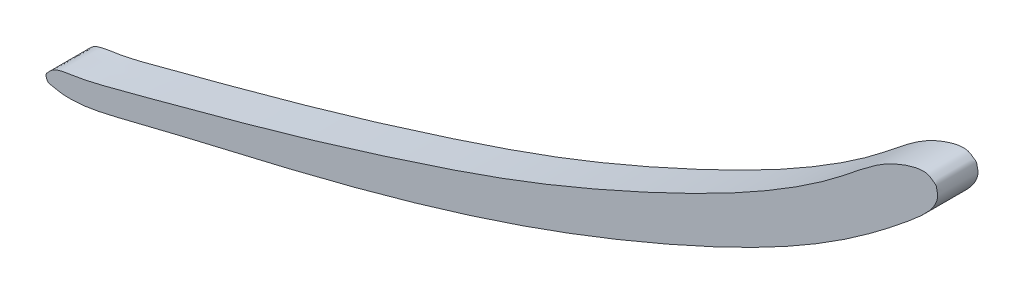
ISO-10303-21;
HEADER;
FILE_DESCRIPTION(('STEP AP214'),'2;1');
FILE_NAME('part.step','',(''),(''),'','','');
FILE_SCHEMA(('AUTOMOTIVE_DESIGN { 1 0 10303 214 1 1 1 1 }'));
ENDSEC;
DATA;
#1=APPLICATION_CONTEXT('core data for automotive mechanical design processes');
#2=APPLICATION_PROTOCOL_DEFINITION('international standard','automotive_design',2000,#1);
#3=PRODUCT_CONTEXT('',#1,'mechanical');
#4=PRODUCT('Part','Part','',(#3));
#5=PRODUCT_RELATED_PRODUCT_CATEGORY('part','',(#4));
#6=PRODUCT_DEFINITION_FORMATION('','',#4);
#7=PRODUCT_DEFINITION_CONTEXT('part definition',#1,'design');
#8=PRODUCT_DEFINITION('design','',#6,#7);
#9=PRODUCT_DEFINITION_SHAPE('','',#8);
#10=(LENGTH_UNIT() NAMED_UNIT(*) SI_UNIT(.MILLI.,.METRE.));
#11=(NAMED_UNIT(*) PLANE_ANGLE_UNIT() SI_UNIT($,.RADIAN.));
#12=(NAMED_UNIT(*) SI_UNIT($,.STERADIAN.) SOLID_ANGLE_UNIT());
#13=UNCERTAINTY_MEASURE_WITH_UNIT(LENGTH_MEASURE(1.E-05),#10,'distance_accuracy_value','');
#14=(GEOMETRIC_REPRESENTATION_CONTEXT(3) GLOBAL_UNCERTAINTY_ASSIGNED_CONTEXT((#13)) GLOBAL_UNIT_ASSIGNED_CONTEXT((#10,
#11,#12)) REPRESENTATION_CONTEXT('',''));
#15=CARTESIAN_POINT('',(0.,0.,0.));
#16=DIRECTION('',(0.,0.,1.));
#17=DIRECTION('',(1.,0.,0.));
#18=AXIS2_PLACEMENT_3D('',#15,#16,#17);
#19=CARTESIAN_POINT('',(97.6402715036178,0.,212.));
#20=CARTESIAN_POINT('',(97.5791761893551,0.113097434825663,212.));
#21=CARTESIAN_POINT('',(97.4814258269554,0.196352593071766,212.));
#22=CARTESIAN_POINT('',(97.2797911251506,0.350136693146681,212.));
#23=CARTESIAN_POINT('',(97.1743189084082,0.420472955562523,212.));
#24=CARTESIAN_POINT('',(96.9664992701994,0.565546357862091,212.));
#25=CARTESIAN_POINT('',(96.8639314628731,0.639973112238927,212.));
#26=CARTESIAN_POINT('',(96.6535180789364,0.781393552944972,212.));
#27=CARTESIAN_POINT('',(96.5458360178521,0.848425050957064,212.));
#28=CARTESIAN_POINT('',(96.3260098885516,0.971216129741667,212.));
#29=CARTESIAN_POINT('',(96.2135831688717,1.0270312472367,212.));
#30=CARTESIAN_POINT('',(95.9792028434163,1.11751138678585,212.));
#31=CARTESIAN_POINT('',(95.8566019241939,1.1526700945648,212.));
#32=CARTESIAN_POINT('',(95.4821194403895,1.23021072487811,212.));
#33=CARTESIAN_POINT('',(95.2307922515973,1.24420004913055,212.));
#34=CARTESIAN_POINT('',(94.7264770370461,1.23473047053956,212.));
#35=CARTESIAN_POINT('',(94.4727586079871,1.21024821445514,212.));
#36=CARTESIAN_POINT('',(93.9733537408801,1.14238467836488,212.));
#37=CARTESIAN_POINT('',(93.7262298830899,1.09861881118032,212.));
#38=CARTESIAN_POINT('',(92.9917557281853,0.941016030632116,212.));
#39=CARTESIAN_POINT('',(92.5108672499247,0.802535215725864,212.));
#40=CARTESIAN_POINT('',(91.5572445946872,0.494474942863385,212.));
#41=CARTESIAN_POINT('',(91.0837641417088,0.322685212673183,212.));
#42=CARTESIAN_POINT('',(90.150829286711,-0.0496923593369548,212.));
#43=CARTESIAN_POINT('',(89.6923584603408,-0.249180006693082,212.));
#44=CARTESIAN_POINT('',(88.3391236814597,-0.884525888861977,212.));
#45=CARTESIAN_POINT('',(87.4672649446348,-1.35847696871283,212.));
#46=CARTESIAN_POINT('',(84.9397030044603,-2.92670359350688,212.));
#47=CARTESIAN_POINT('',(83.3659313648548,-4.15744787210965,212.));
#48=CARTESIAN_POINT('',(81.0239462934617,-6.03381361180035,212.));
#49=CARTESIAN_POINT('',(80.24551542607,-6.66290322018702,212.));
#50=CARTESIAN_POINT('',(78.6769328903777,-7.90198740791915,212.));
#51=CARTESIAN_POINT('',(77.8880258931341,-8.51400975227565,212.));
#52=CARTESIAN_POINT('',(75.495703929223,-10.3083687731489,212.));
#53=CARTESIAN_POINT('',(73.8662802906018,-11.4483332303841,212.));
#54=CARTESIAN_POINT('',(70.5613717329283,-13.6532210709281,212.));
#55=CARTESIAN_POINT('',(68.8862994279763,-14.7188166675342,212.));
#56=CARTESIAN_POINT('',(65.5019624349238,-16.7943030881574,212.));
#57=CARTESIAN_POINT('',(63.7923749883043,-17.8036680877584,212.));
#58=CARTESIAN_POINT('',(60.3390416212229,-19.7667485579667,212.));
#59=CARTESIAN_POINT('',(58.595654061873,-20.7210478552164,212.));
#60=CARTESIAN_POINT('',(55.0821149228751,-22.5860436491215,212.));
#61=CARTESIAN_POINT('',(53.3120112360379,-23.4968181707019,212.));
#62=CARTESIAN_POINT('',(49.7523466707401,-25.286668386966,212.));
#63=CARTESIAN_POINT('',(47.9624315709493,-26.1658099124608,212.));
#64=CARTESIAN_POINT('',(42.5697532723567,-28.761623920378,212.));
#65=CARTESIAN_POINT('',(38.947924931225,-30.4362581393385,212.));
#66=CARTESIAN_POINT('',(31.6633050263558,-33.6921149190032,212.));
#67=CARTESIAN_POINT('',(28.0012309193083,-35.2732866604625,212.));
#68=CARTESIAN_POINT('',(20.6266150081669,-38.3162372115199,212.));
#69=CARTESIAN_POINT('',(16.9115314991957,-39.7751623115847,212.));
#70=CARTESIAN_POINT('',(9.43396440026264,-42.5568434419293,212.));
#71=CARTESIAN_POINT('',(5.67130593273085,-43.8808067839223,212.));
#72=CARTESIAN_POINT('',(-1.88491192240515,-46.4421753602542,212.));
#73=CARTESIAN_POINT('',(-5.67728574005016,-47.6826687476336,212.));
#74=CARTESIAN_POINT('',(-13.2759593416993,-50.1164323409612,212.));
#75=CARTESIAN_POINT('',(-17.0834892029436,-51.3074761571537,212.));
#76=CARTESIAN_POINT('',(-24.7174060622081,-53.6300951286474,212.));
#77=CARTESIAN_POINT('',(-28.5436667028384,-54.759985506367,212.));
#78=CARTESIAN_POINT('',(-40.0491359475421,-58.0556759574112,212.));
#79=CARTESIAN_POINT('',(-47.7536939404604,-60.1337292919126,212.));
#80=CARTESIAN_POINT('',(-57.387796968521,-62.7160343314417,212.));
#81=CARTESIAN_POINT('',(-59.314870922479,-63.2315556678604,212.));
#82=CARTESIAN_POINT('',(-63.1715083906307,-64.2532311940724,212.));
#83=CARTESIAN_POINT('',(-65.1006890094787,-64.7608277472113,212.));
#84=CARTESIAN_POINT('',(-67.9980551917101,-65.5084260794727,212.));
#85=CARTESIAN_POINT('',(-68.9653216952669,-65.7513936841754,212.));
#86=CARTESIAN_POINT('',(-70.9113327261605,-66.1847813188791,212.));
#87=CARTESIAN_POINT('',(-71.8902005738281,-66.3760528545392,212.));
#88=CARTESIAN_POINT('',(-73.8622259521193,-66.6882866458343,212.));
#89=CARTESIAN_POINT('',(-74.8566629544805,-66.7998239840813,212.));
#90=CARTESIAN_POINT('',(-76.3119908853258,-67.1593672778394,212.));
#91=CARTESIAN_POINT('',(-76.7964162008625,-67.3136487515221,212.));
#92=CARTESIAN_POINT('',(-77.3411951769754,-67.612730895819,212.));
#93=CARTESIAN_POINT('',(-77.4473042359936,-67.6779568079219,212.));
#94=CARTESIAN_POINT('',(-77.6525501308562,-67.8216575325256,212.));
#95=CARTESIAN_POINT('',(-77.7520868643388,-67.9006104512343,212.));
#96=CARTESIAN_POINT('',(-77.9436367416852,-68.0651966853871,212.));
#97=CARTESIAN_POINT('',(-78.0358011384498,-68.1508608752256,212.));
#98=CARTESIAN_POINT('',(-78.2132732449661,-68.3285911722357,212.));
#99=CARTESIAN_POINT('',(-78.2986048172232,-68.4206349995824,212.));
#100=CARTESIAN_POINT('',(-78.468958169911,-68.6050118991632,212.));
#101=CARTESIAN_POINT('',(-78.5539007771626,-68.6974188934163,212.));
#102=CARTESIAN_POINT('',(-78.7087710039652,-68.8962520007533,212.));
#103=CARTESIAN_POINT('',(-78.7820027454093,-69.0069505412673,212.));
#104=CARTESIAN_POINT('',(-78.8349185992612,-69.2601836581533,212.));
#105=CARTESIAN_POINT('',(-78.8143080335718,-69.3926284784747,212.));
#106=CARTESIAN_POINT('',(-78.7463007992558,-69.6390516619597,212.));
#107=CARTESIAN_POINT('',(-78.7017666690811,-69.7587180932018,212.));
#108=CARTESIAN_POINT('',(-78.597883630005,-69.993063471384,212.));
#109=CARTESIAN_POINT('',(-78.537427032215,-70.1092010101122,212.));
#110=CARTESIAN_POINT('',(-78.4031774100869,-70.2480363619875,212.));
#111=CARTESIAN_POINT('',(-78.35249608105,-70.2873776875024,212.));
#112=CARTESIAN_POINT('',(-78.2388079427947,-70.3492588735713,212.));
#113=CARTESIAN_POINT('',(-78.1784384576021,-70.3699211427805,212.));
#114=CARTESIAN_POINT('',(-77.9927677954544,-70.4186068717214,212.));
#115=CARTESIAN_POINT('',(-77.8645315225786,-70.434999971861,212.));
#116=CARTESIAN_POINT('',(-77.6109552693968,-70.4763964749393,212.));
#117=CARTESIAN_POINT('',(-77.484743628726,-70.5003312928667,212.));
#118=CARTESIAN_POINT('',(-77.1071013966302,-70.5781130340016,212.));
#119=CARTESIAN_POINT('',(-76.8564828718042,-70.6369976965743,212.));
#120=CARTESIAN_POINT('',(-76.3534295204674,-70.7435952653269,212.));
#121=CARTESIAN_POINT('',(-76.1005566017966,-70.7886135426737,212.));
#122=CARTESIAN_POINT('',(-75.3359476467371,-70.886823700144,212.));
#123=CARTESIAN_POINT('',(-74.8183739936947,-70.911742566547,212.));
#124=CARTESIAN_POINT('',(-73.2805411993199,-70.9257929748431,212.));
#125=CARTESIAN_POINT('',(-72.2632169658493,-70.8609774323383,212.));
#126=CARTESIAN_POINT('',(-70.2408851275035,-70.6156561801023,212.));
#127=CARTESIAN_POINT('',(-69.2357902397716,-70.4359703187723,212.));
#128=CARTESIAN_POINT('',(-67.2308462337457,-70.0273250519131,212.));
#129=CARTESIAN_POINT('',(-66.231942468377,-69.7983850150328,212.));
#130=CARTESIAN_POINT('',(-64.2406089813755,-69.321615301359,212.));
#131=CARTESIAN_POINT('',(-63.2469757147807,-69.0748218324662,212.));
#132=CARTESIAN_POINT('',(-60.2673876123944,-68.3290174376811,212.));
#133=CARTESIAN_POINT('',(-58.2816943789435,-67.8289151844301,212.));
#134=CARTESIAN_POINT('',(-52.3160953016026,-66.3631458088011,212.));
#135=CARTESIAN_POINT('',(-48.3293280432621,-65.4262004936401,212.));
#136=CARTESIAN_POINT('',(-40.3552381486729,-63.5550460425714,212.));
#137=CARTESIAN_POINT('',(-36.3682592993543,-62.6191226464975,212.));
#138=CARTESIAN_POINT('',(-28.4080464329399,-60.692427277343,212.));
#139=CARTESIAN_POINT('',(-24.4345793866141,-59.7025559789121,212.));
#140=CARTESIAN_POINT('',(-16.5074254321404,-57.6437939249283,212.));
#141=CARTESIAN_POINT('',(-12.5531718068016,-56.5748239812623,212.));
#142=CARTESIAN_POINT('',(-0.730902192158314,-53.2287958210245,212.));
#143=CARTESIAN_POINT('',(7.09899600283924,-50.8116713472615,212.));
#144=CARTESIAN_POINT('',(18.7141169878164,-46.8257293900068,212.));
#145=CARTESIAN_POINT('',(22.5646569961253,-45.4359435691476,212.));
#146=CARTESIAN_POINT('',(30.2234499566605,-42.5342304392706,212.));
#147=CARTESIAN_POINT('',(34.0313127274281,-41.0223198159866,212.));
#148=CARTESIAN_POINT('',(41.5994144958822,-37.8887330754146,212.));
#149=CARTESIAN_POINT('',(45.3613854553926,-36.2659216960279,212.));
#150=CARTESIAN_POINT('',(52.8272508194059,-32.8997810430862,212.));
#151=CARTESIAN_POINT('',(56.5321899730016,-31.1570302133903,212.));
#152=CARTESIAN_POINT('',(63.8605188981552,-27.4976702219522,212.));
#153=CARTESIAN_POINT('',(67.4825651166542,-25.5805603141384,212.));
#154=CARTESIAN_POINT('',(72.8022333030632,-22.5109976520817,212.));
#155=CARTESIAN_POINT('',(74.5577187921029,-21.4548240028801,212.));
#156=CARTESIAN_POINT('',(78.0237014932199,-19.269594656153,212.));
#157=CARTESIAN_POINT('',(79.7328976599107,-18.1414771100234,212.));
#158=CARTESIAN_POINT('',(84.7863794468003,-14.6465558278327,212.));
#159=CARTESIAN_POINT('',(88.052520493008,-12.1653729843958,212.));
#160=CARTESIAN_POINT('',(92.0226892975579,-8.92907880063827,212.));
#161=CARTESIAN_POINT('',(92.8112811606637,-8.27465552843717,212.));
#162=CARTESIAN_POINT('',(93.9726941924374,-7.2687418659918,212.));
#163=CARTESIAN_POINT('',(94.3553683081195,-6.92839145752925,212.));
#164=CARTESIAN_POINT('',(95.1052067295337,-6.23015750252267,212.));
#165=CARTESIAN_POINT('',(95.4733202202446,-5.8733955900667,212.));
#166=CARTESIAN_POINT('',(96.173999597746,-5.13085788860024,212.));
#167=CARTESIAN_POINT('',(96.5067708296623,-4.74456549933476,212.));
#168=CARTESIAN_POINT('',(97.1108858949798,-3.91945152616704,212.));
#169=CARTESIAN_POINT('',(97.3815047326488,-3.47574232889618,212.));
#170=CARTESIAN_POINT('',(97.6950918293272,-2.77449229285741,212.));
#171=CARTESIAN_POINT('',(97.7861539987611,-2.53375923954304,212.));
#172=CARTESIAN_POINT('',(97.9171147547223,-2.03290598185632,212.));
#173=CARTESIAN_POINT('',(97.9565347772589,-1.77939804098503,212.));
#174=CARTESIAN_POINT('',(97.9436125098254,-1.39061684363379,212.));
#175=CARTESIAN_POINT('',(97.9259029527921,-1.26107090290025,212.));
#176=CARTESIAN_POINT('',(97.8778294317182,-1.00642773217353,212.));
#177=CARTESIAN_POINT('',(97.847013089437,-0.880375668392341,212.));
#178=CARTESIAN_POINT('',(97.7881849168708,-0.627746377384552,212.));
#179=CARTESIAN_POINT('',(97.7640972775401,-0.500434319412227,212.));
#180=CARTESIAN_POINT('',(97.7306611955741,-0.308961505253714,212.));
#181=CARTESIAN_POINT('',(97.7200981937859,-0.244905212760825,212.));
#182=CARTESIAN_POINT('',(97.6907173973072,-0.119289115392413,212.));
#183=CARTESIAN_POINT('',(97.6708191607491,-0.05654871741282,212.));
#184=CARTESIAN_POINT('',(97.6402715036178,0.,212.));
#185=B_SPLINE_CURVE_WITH_KNOTS('',3,(#19,#20,#21,#22,#23,#24,#25,#26,#27,#28,#29,#30,#31,#32,
#33,#34,#35,#36,#37,#38,#39,#40,#41,#42,#43,#44,#45,#46,#47,#48,#49,#50,#51,#52,#53,#54,#55,#56,
#57,#58,#59,#60,#61,#62,#63,#64,#65,#66,#67,#68,#69,#70,#71,#72,#73,#74,#75,#76,#77,#78,#79,#80,
#81,#82,#83,#84,#85,#86,#87,#88,#89,#90,#91,#92,#93,#94,#95,#96,#97,#98,#99,#100,#101,#102,#103,
#104,#105,#106,#107,#108,#109,#110,#111,#112,#113,#114,#115,#116,#117,#118,#119,#120,#121,#122,
#123,#124,#125,#126,#127,#128,#129,#130,#131,#132,#133,#134,#135,#136,#137,#138,#139,#140,#141,
#142,#143,#144,#145,#146,#147,#148,#149,#150,#151,#152,#153,#154,#155,#156,#157,#158,#159,#160,
#161,#162,#163,#164,#165,#166,#167,#168,#169,#170,#171,#172,#173,#174,#175,#176,#177,#178,#179,
#180,#181,#182,#183,#184),.UNSPECIFIED.,.T.,.F.,(4,2,2,2,2,2,2,2,2,2,2,2,2,2,2,2,2,2,2,2,2,2,2,
2,2,2,2,2,2,2,2,2,2,2,2,2,2,2,2,2,2,2,2,2,2,2,2,2,2,2,2,2,2,2,2,2,2,2,2,2,2,2,2,2,2,2,2,2,2,2,2,
2,2,2,2,2,2,2,2,2,2,2,4),(0.,0.000976562500000018,0.00195312500000004,0.00292968750000005,
0.00390625000000007,0.00488281250000009,0.00585937500000011,0.00781250000000004,
0.00976562499999997,0.0117187499999999,0.0156249999999999,0.0195312499999998,0.0234374999999998,
0.0312499999999996,0.0468749999999994,0.0546874999999993,0.0624999999999992,0.0781249999999989,
0.0937499999999986,0.109374999999998,0.124999999999998,0.140624999999998,0.156249999999997,
0.187499999999997,0.218749999999996,0.249999999999996,0.281249999999995,0.312499999999995,
0.343749999999994,0.374999999999994,0.437499999999993,0.453124999999992,0.468749999999992,
0.476562499999992,0.484374999999992,0.492187499999992,0.496093749999992,0.497070312499992,
0.498046874999992,0.499023437499992,0.499999999999991,0.500976562499991,0.501953124999991,
0.502929687499991,0.503906249999992,0.504882812499992,0.505371093749992,0.505859374999992,
0.506835937499992,0.507812499999992,0.509765624999992,0.511718749999992,0.515624999999992,
0.523437499999992,0.531249999999992,0.539062499999992,0.546874999999992,0.562499999999993,
0.593749999999993,0.624999999999994,0.656249999999994,0.687499999999995,0.749999999999996,
0.781249999999996,0.812499999999997,0.843749999999998,0.874999999999998,0.906249999999999,
0.921874999999999,0.937499999999999,0.96875,0.9765625,0.98046875,0.984375,0.98828125,0.9921875,
0.994140625,0.99609375,0.9970703125,0.998046875,0.9990234375,0.99951171875,1.),.UNSPECIFIED.);
#186=DIRECTION('',(0.,0.,-1.));
#187=VECTOR('',#186,1.);
#188=SURFACE_OF_LINEAR_EXTRUSION('',#185,#187);
#189=CARTESIAN_POINT('',(97.6402715036178,0.,212.));
#190=CARTESIAN_POINT('',(97.6708191607491,-0.05654871741282,212.));
#191=CARTESIAN_POINT('',(97.6907173973072,-0.119289115392413,212.));
#192=CARTESIAN_POINT('',(97.7200981937859,-0.244905212760825,212.));
#193=CARTESIAN_POINT('',(97.7306611955741,-0.308961505253714,212.));
#194=CARTESIAN_POINT('',(97.7640972775401,-0.500434319412227,212.));
#195=CARTESIAN_POINT('',(97.7881849168708,-0.627746377384552,212.));
#196=CARTESIAN_POINT('',(97.847013089437,-0.880375668392341,212.));
#197=CARTESIAN_POINT('',(97.8778294317182,-1.00642773217353,212.));
#198=CARTESIAN_POINT('',(97.9259029527921,-1.26107090290025,212.));
#199=CARTESIAN_POINT('',(97.9436125098254,-1.39061684363379,212.));
#200=CARTESIAN_POINT('',(97.9565347772589,-1.77939804098503,212.));
#201=CARTESIAN_POINT('',(97.9171147547223,-2.03290598185632,212.));
#202=CARTESIAN_POINT('',(97.7861539987611,-2.53375923954304,212.));
#203=CARTESIAN_POINT('',(97.6950918293272,-2.77449229285741,212.));
#204=CARTESIAN_POINT('',(97.3815047326488,-3.47574232889618,212.));
#205=CARTESIAN_POINT('',(97.1108858949798,-3.91945152616704,212.));
#206=CARTESIAN_POINT('',(96.5067708296623,-4.74456549933476,212.));
#207=CARTESIAN_POINT('',(96.173999597746,-5.13085788860024,212.));
#208=CARTESIAN_POINT('',(95.4733202202446,-5.8733955900667,212.));
#209=CARTESIAN_POINT('',(95.1052067295337,-6.23015750252267,212.));
#210=CARTESIAN_POINT('',(94.3553683081195,-6.92839145752925,212.));
#211=CARTESIAN_POINT('',(93.9726941924374,-7.2687418659918,212.));
#212=CARTESIAN_POINT('',(92.8112811606637,-8.27465552843717,212.));
#213=CARTESIAN_POINT('',(92.0226892975579,-8.92907880063827,212.));
#214=CARTESIAN_POINT('',(88.052520493008,-12.1653729843958,212.));
#215=CARTESIAN_POINT('',(84.7863794468003,-14.6465558278327,212.));
#216=CARTESIAN_POINT('',(79.7328976599107,-18.1414771100234,212.));
#217=CARTESIAN_POINT('',(78.0237014932199,-19.269594656153,212.));
#218=CARTESIAN_POINT('',(74.5577187921029,-21.4548240028801,212.));
#219=CARTESIAN_POINT('',(72.8022333030632,-22.5109976520817,212.));
#220=CARTESIAN_POINT('',(67.4825651166542,-25.5805603141384,212.));
#221=CARTESIAN_POINT('',(63.8605188981552,-27.4976702219522,212.));
#222=CARTESIAN_POINT('',(56.5321899730016,-31.1570302133903,212.));
#223=CARTESIAN_POINT('',(52.8272508194059,-32.8997810430862,212.));
#224=CARTESIAN_POINT('',(45.3613854553926,-36.2659216960279,212.));
#225=CARTESIAN_POINT('',(41.5994144958822,-37.8887330754146,212.));
#226=CARTESIAN_POINT('',(34.0313127274281,-41.0223198159866,212.));
#227=CARTESIAN_POINT('',(30.2234499566605,-42.5342304392706,212.));
#228=CARTESIAN_POINT('',(22.5646569961253,-45.4359435691476,212.));
#229=CARTESIAN_POINT('',(18.7141169878164,-46.8257293900068,212.));
#230=CARTESIAN_POINT('',(7.09899600283924,-50.8116713472615,212.));
#231=CARTESIAN_POINT('',(-0.730902192158314,-53.2287958210245,212.));
#232=CARTESIAN_POINT('',(-12.5531718068016,-56.5748239812623,212.));
#233=CARTESIAN_POINT('',(-16.5074254321404,-57.6437939249283,212.));
#234=CARTESIAN_POINT('',(-24.4345793866141,-59.7025559789121,212.));
#235=CARTESIAN_POINT('',(-28.4080464329399,-60.692427277343,212.));
#236=CARTESIAN_POINT('',(-36.3682592993543,-62.6191226464975,212.));
#237=CARTESIAN_POINT('',(-40.3552381486729,-63.5550460425714,212.));
#238=CARTESIAN_POINT('',(-48.3293280432621,-65.4262004936401,212.));
#239=CARTESIAN_POINT('',(-52.3160953016026,-66.3631458088011,212.));
#240=CARTESIAN_POINT('',(-58.2816943789435,-67.8289151844301,212.));
#241=CARTESIAN_POINT('',(-60.2673876123944,-68.3290174376811,212.));
#242=CARTESIAN_POINT('',(-63.2469757147807,-69.0748218324662,212.));
#243=CARTESIAN_POINT('',(-64.2406089813755,-69.321615301359,212.));
#244=CARTESIAN_POINT('',(-66.231942468377,-69.7983850150328,212.));
#245=CARTESIAN_POINT('',(-67.2308462337457,-70.0273250519131,212.));
#246=CARTESIAN_POINT('',(-69.2357902397716,-70.4359703187723,212.));
#247=CARTESIAN_POINT('',(-70.2408851275035,-70.6156561801023,212.));
#248=CARTESIAN_POINT('',(-72.2632169658493,-70.8609774323383,212.));
#249=CARTESIAN_POINT('',(-73.2805411993199,-70.9257929748431,212.));
#250=CARTESIAN_POINT('',(-74.8183739936947,-70.911742566547,212.));
#251=CARTESIAN_POINT('',(-75.3359476467371,-70.886823700144,212.));
#252=CARTESIAN_POINT('',(-76.1005566017966,-70.7886135426737,212.));
#253=CARTESIAN_POINT('',(-76.3534295204674,-70.7435952653269,212.));
#254=CARTESIAN_POINT('',(-76.8564828718042,-70.6369976965743,212.));
#255=CARTESIAN_POINT('',(-77.1071013966302,-70.5781130340016,212.));
#256=CARTESIAN_POINT('',(-77.484743628726,-70.5003312928667,212.));
#257=CARTESIAN_POINT('',(-77.6109552693968,-70.4763964749393,212.));
#258=CARTESIAN_POINT('',(-77.8645315225786,-70.434999971861,212.));
#259=CARTESIAN_POINT('',(-77.9927677954544,-70.4186068717214,212.));
#260=CARTESIAN_POINT('',(-78.1784384576021,-70.3699211427805,212.));
#261=CARTESIAN_POINT('',(-78.2388079427947,-70.3492588735713,212.));
#262=CARTESIAN_POINT('',(-78.35249608105,-70.2873776875024,212.));
#263=CARTESIAN_POINT('',(-78.4031774100869,-70.2480363619875,212.));
#264=CARTESIAN_POINT('',(-78.537427032215,-70.1092010101122,212.));
#265=CARTESIAN_POINT('',(-78.597883630005,-69.993063471384,212.));
#266=CARTESIAN_POINT('',(-78.7017666690811,-69.7587180932018,212.));
#267=CARTESIAN_POINT('',(-78.7463007992558,-69.6390516619597,212.));
#268=CARTESIAN_POINT('',(-78.8143080335718,-69.3926284784747,212.));
#269=CARTESIAN_POINT('',(-78.8349185992612,-69.2601836581533,212.));
#270=CARTESIAN_POINT('',(-78.7820027454093,-69.0069505412673,212.));
#271=CARTESIAN_POINT('',(-78.7087710039652,-68.8962520007533,212.));
#272=CARTESIAN_POINT('',(-78.5539007771626,-68.6974188934163,212.));
#273=CARTESIAN_POINT('',(-78.468958169911,-68.6050118991632,212.));
#274=CARTESIAN_POINT('',(-78.2986048172232,-68.4206349995824,212.));
#275=CARTESIAN_POINT('',(-78.2132732449661,-68.3285911722357,212.));
#276=CARTESIAN_POINT('',(-78.0358011384498,-68.1508608752256,212.));
#277=CARTESIAN_POINT('',(-77.9436367416852,-68.0651966853871,212.));
#278=CARTESIAN_POINT('',(-77.7520868643388,-67.9006104512343,212.));
#279=CARTESIAN_POINT('',(-77.6525501308562,-67.8216575325256,212.));
#280=CARTESIAN_POINT('',(-77.4473042359936,-67.6779568079219,212.));
#281=CARTESIAN_POINT('',(-77.3411951769754,-67.612730895819,212.));
#282=CARTESIAN_POINT('',(-76.7964162008625,-67.3136487515221,212.));
#283=CARTESIAN_POINT('',(-76.3119908853258,-67.1593672778394,212.));
#284=CARTESIAN_POINT('',(-74.8566629544805,-66.7998239840813,212.));
#285=CARTESIAN_POINT('',(-73.8622259521193,-66.6882866458343,212.));
#286=CARTESIAN_POINT('',(-71.8902005738281,-66.3760528545392,212.));
#287=CARTESIAN_POINT('',(-70.9113327261605,-66.1847813188791,212.));
#288=CARTESIAN_POINT('',(-68.9653216952669,-65.7513936841754,212.));
#289=CARTESIAN_POINT('',(-67.9980551917101,-65.5084260794727,212.));
#290=CARTESIAN_POINT('',(-65.1006890094787,-64.7608277472113,212.));
#291=CARTESIAN_POINT('',(-63.1715083906307,-64.2532311940724,212.));
#292=CARTESIAN_POINT('',(-59.314870922479,-63.2315556678604,212.));
#293=CARTESIAN_POINT('',(-57.387796968521,-62.7160343314417,212.));
#294=CARTESIAN_POINT('',(-47.7536939404604,-60.1337292919126,212.));
#295=CARTESIAN_POINT('',(-40.0491359475421,-58.0556759574112,212.));
#296=CARTESIAN_POINT('',(-28.5436667028384,-54.759985506367,212.));
#297=CARTESIAN_POINT('',(-24.7174060622081,-53.6300951286474,212.));
#298=CARTESIAN_POINT('',(-17.0834892029436,-51.3074761571537,212.));
#299=CARTESIAN_POINT('',(-13.2759593416993,-50.1164323409612,212.));
#300=CARTESIAN_POINT('',(-5.67728574005016,-47.6826687476336,212.));
#301=CARTESIAN_POINT('',(-1.88491192240515,-46.4421753602542,212.));
#302=CARTESIAN_POINT('',(5.67130593273085,-43.8808067839223,212.));
#303=CARTESIAN_POINT('',(9.43396440026264,-42.5568434419293,212.));
#304=CARTESIAN_POINT('',(16.9115314991957,-39.7751623115847,212.));
#305=CARTESIAN_POINT('',(20.6266150081669,-38.3162372115199,212.));
#306=CARTESIAN_POINT('',(28.0012309193083,-35.2732866604625,212.));
#307=CARTESIAN_POINT('',(31.6633050263558,-33.6921149190032,212.));
#308=CARTESIAN_POINT('',(38.947924931225,-30.4362581393385,212.));
#309=CARTESIAN_POINT('',(42.5697532723567,-28.761623920378,212.));
#310=CARTESIAN_POINT('',(47.9624315709493,-26.1658099124608,212.));
#311=CARTESIAN_POINT('',(49.7523466707401,-25.286668386966,212.));
#312=CARTESIAN_POINT('',(53.3120112360379,-23.4968181707019,212.));
#313=CARTESIAN_POINT('',(55.0821149228751,-22.5860436491215,212.));
#314=CARTESIAN_POINT('',(58.595654061873,-20.7210478552164,212.));
#315=CARTESIAN_POINT('',(60.3390416212229,-19.7667485579667,212.));
#316=CARTESIAN_POINT('',(63.7923749883043,-17.8036680877584,212.));
#317=CARTESIAN_POINT('',(65.5019624349238,-16.7943030881574,212.));
#318=CARTESIAN_POINT('',(68.8862994279763,-14.7188166675342,212.));
#319=CARTESIAN_POINT('',(70.5613717329283,-13.6532210709281,212.));
#320=CARTESIAN_POINT('',(73.8662802906018,-11.4483332303841,212.));
#321=CARTESIAN_POINT('',(75.495703929223,-10.3083687731489,212.));
#322=CARTESIAN_POINT('',(77.8880258931341,-8.51400975227565,212.));
#323=CARTESIAN_POINT('',(78.6769328903777,-7.90198740791915,212.));
#324=CARTESIAN_POINT('',(80.24551542607,-6.66290322018702,212.));
#325=CARTESIAN_POINT('',(81.0239462934617,-6.03381361180035,212.));
#326=CARTESIAN_POINT('',(83.3659313648548,-4.15744787210965,212.));
#327=CARTESIAN_POINT('',(84.9397030044603,-2.92670359350688,212.));
#328=CARTESIAN_POINT('',(87.4672649446348,-1.35847696871283,212.));
#329=CARTESIAN_POINT('',(88.3391236814597,-0.884525888861977,212.));
#330=CARTESIAN_POINT('',(89.6923584603408,-0.249180006693082,212.));
#331=CARTESIAN_POINT('',(90.150829286711,-0.0496923593369548,212.));
#332=CARTESIAN_POINT('',(91.0837641417088,0.322685212673183,212.));
#333=CARTESIAN_POINT('',(91.5572445946872,0.494474942863385,212.));
#334=CARTESIAN_POINT('',(92.5108672499247,0.802535215725864,212.));
#335=CARTESIAN_POINT('',(92.9917557281853,0.941016030632116,212.));
#336=CARTESIAN_POINT('',(93.7262298830899,1.09861881118032,212.));
#337=CARTESIAN_POINT('',(93.9733537408801,1.14238467836488,212.));
#338=CARTESIAN_POINT('',(94.4727586079871,1.21024821445514,212.));
#339=CARTESIAN_POINT('',(94.7264770370461,1.23473047053956,212.));
#340=CARTESIAN_POINT('',(95.2307922515973,1.24420004913055,212.));
#341=CARTESIAN_POINT('',(95.4821194403895,1.23021072487811,212.));
#342=CARTESIAN_POINT('',(95.8566019241939,1.1526700945648,212.));
#343=CARTESIAN_POINT('',(95.9792028434163,1.11751138678585,212.));
#344=CARTESIAN_POINT('',(96.2135831688717,1.0270312472367,212.));
#345=CARTESIAN_POINT('',(96.3260098885516,0.971216129741667,212.));
#346=CARTESIAN_POINT('',(96.5458360178521,0.848425050957064,212.));
#347=CARTESIAN_POINT('',(96.6535180789364,0.781393552944972,212.));
#348=CARTESIAN_POINT('',(96.8639314628731,0.639973112238927,212.));
#349=CARTESIAN_POINT('',(96.9664992701994,0.565546357862091,212.));
#350=CARTESIAN_POINT('',(97.1743189084082,0.420472955562523,212.));
#351=CARTESIAN_POINT('',(97.2797911251506,0.350136693146681,212.));
#352=CARTESIAN_POINT('',(97.4814258269554,0.196352593071766,212.));
#353=CARTESIAN_POINT('',(97.5791761893551,0.113097434825663,212.));
#354=CARTESIAN_POINT('',(97.6402715036178,0.,212.));
#355=B_SPLINE_CURVE_WITH_KNOTS('',3,(#189,#190,#191,#192,#193,#194,#195,#196,#197,#198,#199,
#200,#201,#202,#203,#204,#205,#206,#207,#208,#209,#210,#211,#212,#213,#214,#215,#216,#217,#218,
#219,#220,#221,#222,#223,#224,#225,#226,#227,#228,#229,#230,#231,#232,#233,#234,#235,#236,#237,
#238,#239,#240,#241,#242,#243,#244,#245,#246,#247,#248,#249,#250,#251,#252,#253,#254,#255,#256,
#257,#258,#259,#260,#261,#262,#263,#264,#265,#266,#267,#268,#269,#270,#271,#272,#273,#274,#275,
#276,#277,#278,#279,#280,#281,#282,#283,#284,#285,#286,#287,#288,#289,#290,#291,#292,#293,#294,
#295,#296,#297,#298,#299,#300,#301,#302,#303,#304,#305,#306,#307,#308,#309,#310,#311,#312,#313,
#314,#315,#316,#317,#318,#319,#320,#321,#322,#323,#324,#325,#326,#327,#328,#329,#330,#331,#332,
#333,#334,#335,#336,#337,#338,#339,#340,#341,#342,#343,#344,#345,#346,#347,#348,#349,#350,#351,
#352,#353,#354),.UNSPECIFIED.,.T.,.F.,(4,2,2,2,2,2,2,2,2,2,2,2,2,2,2,2,2,2,2,2,2,2,2,2,2,2,2,2,
2,2,2,2,2,2,2,2,2,2,2,2,2,2,2,2,2,2,2,2,2,2,2,2,2,2,2,2,2,2,2,2,2,2,2,2,2,2,2,2,2,2,2,2,2,2,2,2,
2,2,2,2,2,2,4),(0.,0.000488281249999889,0.000976562499999889,0.00195312499999989,
0.00292968749999989,0.00390625,0.005859375,0.0078125,0.0117187500000001,0.0156250000000002,
0.0195312500000002,0.0234375000000003,0.0312500000000004,0.0625000000000009,0.0781250000000011,
0.0937500000000012,0.125000000000002,0.156250000000002,0.187500000000003,0.218750000000004,
0.250000000000004,0.312500000000005,0.343750000000006,0.375000000000006,0.406250000000007,
0.437500000000007,0.453125000000008,0.460937500000008,0.468750000000008,0.476562500000008,
0.484375000000008,0.488281250000008,0.490234375000008,0.492187500000008,0.493164062500008,
0.494140625000008,0.494628906250008,0.495117187500008,0.496093750000008,0.497070312500009,
0.498046875000009,0.499023437500009,0.500000000000009,0.500976562500008,0.501953125000008,
0.502929687500008,0.503906250000008,0.507812500000008,0.515625000000008,0.523437500000008,
0.531250000000008,0.546875000000008,0.562500000000007,0.625000000000006,0.656250000000006,
0.687500000000005,0.718750000000005,0.750000000000004,0.781250000000004,0.812500000000003,
0.843750000000003,0.859375000000002,0.875000000000002,0.890625000000002,0.906250000000001,
0.921875000000001,0.937500000000001,0.945312500000001,0.953125000000001,0.96875,0.9765625,
0.98046875,0.984375,0.98828125,0.990234375,0.9921875,0.994140625,0.9951171875,0.99609375,
0.9970703125,0.998046875,0.9990234375,1.),.UNSPECIFIED.);
#356=CARTESIAN_POINT('',(97.6402715036178,0.,212.));
#357=VERTEX_POINT('',#356);
#358=EDGE_CURVE('E10',#357,#357,#355,.F.);
#359=ORIENTED_EDGE('',*,*,#358,.F.);
#360=EDGE_LOOP('',(#359));
#361=FACE_BOUND('',#360,.T.);
#362=CARTESIAN_POINT('',(97.6402715036178,0.,204.));
#363=CARTESIAN_POINT('',(97.5791761893551,0.113097434825663,204.));
#364=CARTESIAN_POINT('',(97.4814258269554,0.196352593071766,204.));
#365=CARTESIAN_POINT('',(97.2797911251506,0.350136693146681,204.));
#366=CARTESIAN_POINT('',(97.1743189084082,0.420472955562523,204.));
#367=CARTESIAN_POINT('',(96.9664992701994,0.565546357862091,204.));
#368=CARTESIAN_POINT('',(96.8639314628731,0.639973112238927,204.));
#369=CARTESIAN_POINT('',(96.6535180789364,0.781393552944972,204.));
#370=CARTESIAN_POINT('',(96.5458360178521,0.848425050957064,204.));
#371=CARTESIAN_POINT('',(96.3260098885516,0.971216129741667,204.));
#372=CARTESIAN_POINT('',(96.2135831688717,1.0270312472367,204.));
#373=CARTESIAN_POINT('',(95.9792028434163,1.11751138678585,204.));
#374=CARTESIAN_POINT('',(95.8566019241939,1.1526700945648,204.));
#375=CARTESIAN_POINT('',(95.4821194403895,1.23021072487811,204.));
#376=CARTESIAN_POINT('',(95.2307922515973,1.24420004913055,204.));
#377=CARTESIAN_POINT('',(94.7264770370461,1.23473047053956,204.));
#378=CARTESIAN_POINT('',(94.4727586079871,1.21024821445514,204.));
#379=CARTESIAN_POINT('',(93.9733537408801,1.14238467836488,204.));
#380=CARTESIAN_POINT('',(93.7262298830899,1.09861881118032,204.));
#381=CARTESIAN_POINT('',(92.9917557281853,0.941016030632116,204.));
#382=CARTESIAN_POINT('',(92.5108672499247,0.802535215725864,204.));
#383=CARTESIAN_POINT('',(91.5572445946872,0.494474942863385,204.));
#384=CARTESIAN_POINT('',(91.0837641417088,0.322685212673183,204.));
#385=CARTESIAN_POINT('',(90.150829286711,-0.0496923593369548,204.));
#386=CARTESIAN_POINT('',(89.6923584603408,-0.249180006693082,204.));
#387=CARTESIAN_POINT('',(88.3391236814597,-0.884525888861977,204.));
#388=CARTESIAN_POINT('',(87.4672649446348,-1.35847696871283,204.));
#389=CARTESIAN_POINT('',(84.9397030044603,-2.92670359350688,204.));
#390=CARTESIAN_POINT('',(83.3659313648548,-4.15744787210965,204.));
#391=CARTESIAN_POINT('',(81.0239462934617,-6.03381361180035,204.));
#392=CARTESIAN_POINT('',(80.24551542607,-6.66290322018702,204.));
#393=CARTESIAN_POINT('',(78.6769328903777,-7.90198740791915,204.));
#394=CARTESIAN_POINT('',(77.8880258931341,-8.51400975227565,204.));
#395=CARTESIAN_POINT('',(75.495703929223,-10.3083687731489,204.));
#396=CARTESIAN_POINT('',(73.8662802906018,-11.4483332303841,204.));
#397=CARTESIAN_POINT('',(70.5613717329283,-13.6532210709281,204.));
#398=CARTESIAN_POINT('',(68.8862994279763,-14.7188166675342,204.));
#399=CARTESIAN_POINT('',(65.5019624349238,-16.7943030881574,204.));
#400=CARTESIAN_POINT('',(63.7923749883043,-17.8036680877584,204.));
#401=CARTESIAN_POINT('',(60.3390416212229,-19.7667485579667,204.));
#402=CARTESIAN_POINT('',(58.595654061873,-20.7210478552164,204.));
#403=CARTESIAN_POINT('',(55.0821149228751,-22.5860436491215,204.));
#404=CARTESIAN_POINT('',(53.3120112360379,-23.4968181707019,204.));
#405=CARTESIAN_POINT('',(49.7523466707401,-25.286668386966,204.));
#406=CARTESIAN_POINT('',(47.9624315709493,-26.1658099124608,204.));
#407=CARTESIAN_POINT('',(42.5697532723567,-28.761623920378,204.));
#408=CARTESIAN_POINT('',(38.947924931225,-30.4362581393385,204.));
#409=CARTESIAN_POINT('',(31.6633050263558,-33.6921149190032,204.));
#410=CARTESIAN_POINT('',(28.0012309193083,-35.2732866604625,204.));
#411=CARTESIAN_POINT('',(20.6266150081669,-38.3162372115199,204.));
#412=CARTESIAN_POINT('',(16.9115314991957,-39.7751623115847,204.));
#413=CARTESIAN_POINT('',(9.43396440026264,-42.5568434419293,204.));
#414=CARTESIAN_POINT('',(5.67130593273085,-43.8808067839223,204.));
#415=CARTESIAN_POINT('',(-1.88491192240515,-46.4421753602542,204.));
#416=CARTESIAN_POINT('',(-5.67728574005016,-47.6826687476336,204.));
#417=CARTESIAN_POINT('',(-13.2759593416993,-50.1164323409612,204.));
#418=CARTESIAN_POINT('',(-17.0834892029436,-51.3074761571537,204.));
#419=CARTESIAN_POINT('',(-24.7174060622081,-53.6300951286474,204.));
#420=CARTESIAN_POINT('',(-28.5436667028384,-54.759985506367,204.));
#421=CARTESIAN_POINT('',(-40.0491359475421,-58.0556759574112,204.));
#422=CARTESIAN_POINT('',(-47.7536939404604,-60.1337292919126,204.));
#423=CARTESIAN_POINT('',(-57.387796968521,-62.7160343314417,204.));
#424=CARTESIAN_POINT('',(-59.314870922479,-63.2315556678604,204.));
#425=CARTESIAN_POINT('',(-63.1715083906307,-64.2532311940724,204.));
#426=CARTESIAN_POINT('',(-65.1006890094787,-64.7608277472113,204.));
#427=CARTESIAN_POINT('',(-67.9980551917101,-65.5084260794727,204.));
#428=CARTESIAN_POINT('',(-68.9653216952669,-65.7513936841754,204.));
#429=CARTESIAN_POINT('',(-70.9113327261605,-66.1847813188791,204.));
#430=CARTESIAN_POINT('',(-71.8902005738281,-66.3760528545392,204.));
#431=CARTESIAN_POINT('',(-73.8622259521193,-66.6882866458343,204.));
#432=CARTESIAN_POINT('',(-74.8566629544805,-66.7998239840813,204.));
#433=CARTESIAN_POINT('',(-76.3119908853258,-67.1593672778394,204.));
#434=CARTESIAN_POINT('',(-76.7964162008625,-67.3136487515221,204.));
#435=CARTESIAN_POINT('',(-77.3411951769754,-67.612730895819,204.));
#436=CARTESIAN_POINT('',(-77.4473042359936,-67.6779568079219,204.));
#437=CARTESIAN_POINT('',(-77.6525501308562,-67.8216575325256,204.));
#438=CARTESIAN_POINT('',(-77.7520868643388,-67.9006104512343,204.));
#439=CARTESIAN_POINT('',(-77.9436367416852,-68.0651966853871,204.));
#440=CARTESIAN_POINT('',(-78.0358011384498,-68.1508608752256,204.));
#441=CARTESIAN_POINT('',(-78.2132732449661,-68.3285911722357,204.));
#442=CARTESIAN_POINT('',(-78.2986048172232,-68.4206349995824,204.));
#443=CARTESIAN_POINT('',(-78.468958169911,-68.6050118991632,204.));
#444=CARTESIAN_POINT('',(-78.5539007771626,-68.6974188934163,204.));
#445=CARTESIAN_POINT('',(-78.7087710039652,-68.8962520007533,204.));
#446=CARTESIAN_POINT('',(-78.7820027454093,-69.0069505412673,204.));
#447=CARTESIAN_POINT('',(-78.8349185992612,-69.2601836581533,204.));
#448=CARTESIAN_POINT('',(-78.8143080335718,-69.3926284784747,204.));
#449=CARTESIAN_POINT('',(-78.7463007992558,-69.6390516619597,204.));
#450=CARTESIAN_POINT('',(-78.7017666690811,-69.7587180932018,204.));
#451=CARTESIAN_POINT('',(-78.597883630005,-69.993063471384,204.));
#452=CARTESIAN_POINT('',(-78.537427032215,-70.1092010101122,204.));
#453=CARTESIAN_POINT('',(-78.4031774100869,-70.2480363619875,204.));
#454=CARTESIAN_POINT('',(-78.35249608105,-70.2873776875024,204.));
#455=CARTESIAN_POINT('',(-78.2388079427947,-70.3492588735713,204.));
#456=CARTESIAN_POINT('',(-78.1784384576021,-70.3699211427805,204.));
#457=CARTESIAN_POINT('',(-77.9927677954544,-70.4186068717214,204.));
#458=CARTESIAN_POINT('',(-77.8645315225786,-70.434999971861,204.));
#459=CARTESIAN_POINT('',(-77.6109552693968,-70.4763964749393,204.));
#460=CARTESIAN_POINT('',(-77.484743628726,-70.5003312928667,204.));
#461=CARTESIAN_POINT('',(-77.1071013966302,-70.5781130340016,204.));
#462=CARTESIAN_POINT('',(-76.8564828718042,-70.6369976965743,204.));
#463=CARTESIAN_POINT('',(-76.3534295204674,-70.7435952653269,204.));
#464=CARTESIAN_POINT('',(-76.1005566017966,-70.7886135426737,204.));
#465=CARTESIAN_POINT('',(-75.3359476467371,-70.886823700144,204.));
#466=CARTESIAN_POINT('',(-74.8183739936947,-70.911742566547,204.));
#467=CARTESIAN_POINT('',(-73.2805411993199,-70.9257929748431,204.));
#468=CARTESIAN_POINT('',(-72.2632169658493,-70.8609774323383,204.));
#469=CARTESIAN_POINT('',(-70.2408851275035,-70.6156561801023,204.));
#470=CARTESIAN_POINT('',(-69.2357902397716,-70.4359703187723,204.));
#471=CARTESIAN_POINT('',(-67.2308462337457,-70.0273250519131,204.));
#472=CARTESIAN_POINT('',(-66.231942468377,-69.7983850150328,204.));
#473=CARTESIAN_POINT('',(-64.2406089813755,-69.321615301359,204.));
#474=CARTESIAN_POINT('',(-63.2469757147807,-69.0748218324662,204.));
#475=CARTESIAN_POINT('',(-60.2673876123944,-68.3290174376811,204.));
#476=CARTESIAN_POINT('',(-58.2816943789435,-67.8289151844301,204.));
#477=CARTESIAN_POINT('',(-52.3160953016026,-66.3631458088011,204.));
#478=CARTESIAN_POINT('',(-48.3293280432621,-65.4262004936401,204.));
#479=CARTESIAN_POINT('',(-40.3552381486729,-63.5550460425714,204.));
#480=CARTESIAN_POINT('',(-36.3682592993543,-62.6191226464975,204.));
#481=CARTESIAN_POINT('',(-28.4080464329399,-60.692427277343,204.));
#482=CARTESIAN_POINT('',(-24.4345793866141,-59.7025559789121,204.));
#483=CARTESIAN_POINT('',(-16.5074254321404,-57.6437939249283,204.));
#484=CARTESIAN_POINT('',(-12.5531718068016,-56.5748239812623,204.));
#485=CARTESIAN_POINT('',(-0.730902192158314,-53.2287958210245,204.));
#486=CARTESIAN_POINT('',(7.09899600283924,-50.8116713472615,204.));
#487=CARTESIAN_POINT('',(18.7141169878164,-46.8257293900068,204.));
#488=CARTESIAN_POINT('',(22.5646569961253,-45.4359435691476,204.));
#489=CARTESIAN_POINT('',(30.2234499566605,-42.5342304392706,204.));
#490=CARTESIAN_POINT('',(34.0313127274281,-41.0223198159866,204.));
#491=CARTESIAN_POINT('',(41.5994144958822,-37.8887330754146,204.));
#492=CARTESIAN_POINT('',(45.3613854553926,-36.2659216960279,204.));
#493=CARTESIAN_POINT('',(52.8272508194059,-32.8997810430862,204.));
#494=CARTESIAN_POINT('',(56.5321899730016,-31.1570302133903,204.));
#495=CARTESIAN_POINT('',(63.8605188981552,-27.4976702219522,204.));
#496=CARTESIAN_POINT('',(67.4825651166542,-25.5805603141384,204.));
#497=CARTESIAN_POINT('',(72.8022333030632,-22.5109976520817,204.));
#498=CARTESIAN_POINT('',(74.5577187921029,-21.4548240028801,204.));
#499=CARTESIAN_POINT('',(78.0237014932199,-19.269594656153,204.));
#500=CARTESIAN_POINT('',(79.7328976599107,-18.1414771100234,204.));
#501=CARTESIAN_POINT('',(84.7863794468003,-14.6465558278327,204.));
#502=CARTESIAN_POINT('',(88.052520493008,-12.1653729843958,204.));
#503=CARTESIAN_POINT('',(92.0226892975579,-8.92907880063827,204.));
#504=CARTESIAN_POINT('',(92.8112811606637,-8.27465552843717,204.));
#505=CARTESIAN_POINT('',(93.9726941924374,-7.2687418659918,204.));
#506=CARTESIAN_POINT('',(94.3553683081195,-6.92839145752925,204.));
#507=CARTESIAN_POINT('',(95.1052067295337,-6.23015750252267,204.));
#508=CARTESIAN_POINT('',(95.4733202202446,-5.8733955900667,204.));
#509=CARTESIAN_POINT('',(96.173999597746,-5.13085788860024,204.));
#510=CARTESIAN_POINT('',(96.5067708296623,-4.74456549933476,204.));
#511=CARTESIAN_POINT('',(97.1108858949798,-3.91945152616704,204.));
#512=CARTESIAN_POINT('',(97.3815047326488,-3.47574232889618,204.));
#513=CARTESIAN_POINT('',(97.6950918293272,-2.77449229285741,204.));
#514=CARTESIAN_POINT('',(97.7861539987611,-2.53375923954304,204.));
#515=CARTESIAN_POINT('',(97.9171147547223,-2.03290598185632,204.));
#516=CARTESIAN_POINT('',(97.9565347772589,-1.77939804098503,204.));
#517=CARTESIAN_POINT('',(97.9436125098254,-1.39061684363379,204.));
#518=CARTESIAN_POINT('',(97.9259029527921,-1.26107090290025,204.));
#519=CARTESIAN_POINT('',(97.8778294317182,-1.00642773217353,204.));
#520=CARTESIAN_POINT('',(97.847013089437,-0.880375668392341,204.));
#521=CARTESIAN_POINT('',(97.7881849168708,-0.627746377384552,204.));
#522=CARTESIAN_POINT('',(97.7640972775401,-0.500434319412227,204.));
#523=CARTESIAN_POINT('',(97.7306611955741,-0.308961505253714,204.));
#524=CARTESIAN_POINT('',(97.7200981937859,-0.244905212760825,204.));
#525=CARTESIAN_POINT('',(97.6907173973072,-0.119289115392413,204.));
#526=CARTESIAN_POINT('',(97.6708191607491,-0.05654871741282,204.));
#527=CARTESIAN_POINT('',(97.6402715036178,0.,204.));
#528=B_SPLINE_CURVE_WITH_KNOTS('',3,(#362,#363,#364,#365,#366,#367,#368,#369,#370,#371,#372,
#373,#374,#375,#376,#377,#378,#379,#380,#381,#382,#383,#384,#385,#386,#387,#388,#389,#390,#391,
#392,#393,#394,#395,#396,#397,#398,#399,#400,#401,#402,#403,#404,#405,#406,#407,#408,#409,#410,
#411,#412,#413,#414,#415,#416,#417,#418,#419,#420,#421,#422,#423,#424,#425,#426,#427,#428,#429,
#430,#431,#432,#433,#434,#435,#436,#437,#438,#439,#440,#441,#442,#443,#444,#445,#446,#447,#448,
#449,#450,#451,#452,#453,#454,#455,#456,#457,#458,#459,#460,#461,#462,#463,#464,#465,#466,#467,
#468,#469,#470,#471,#472,#473,#474,#475,#476,#477,#478,#479,#480,#481,#482,#483,#484,#485,#486,
#487,#488,#489,#490,#491,#492,#493,#494,#495,#496,#497,#498,#499,#500,#501,#502,#503,#504,#505,
#506,#507,#508,#509,#510,#511,#512,#513,#514,#515,#516,#517,#518,#519,#520,#521,#522,#523,#524,
#525,#526,#527),.UNSPECIFIED.,.T.,.F.,(4,2,2,2,2,2,2,2,2,2,2,2,2,2,2,2,2,2,2,2,2,2,2,2,2,2,2,2,
2,2,2,2,2,2,2,2,2,2,2,2,2,2,2,2,2,2,2,2,2,2,2,2,2,2,2,2,2,2,2,2,2,2,2,2,2,2,2,2,2,2,2,2,2,2,2,2,
2,2,2,2,2,2,4),(0.,0.000976562500000018,0.00195312500000004,0.00292968750000005,
0.00390625000000007,0.00488281250000009,0.00585937500000011,0.00781250000000004,
0.00976562499999997,0.0117187499999999,0.0156249999999999,0.0195312499999998,0.0234374999999998,
0.0312499999999996,0.0468749999999994,0.0546874999999993,0.0624999999999992,0.0781249999999989,
0.0937499999999986,0.109374999999998,0.124999999999998,0.140624999999998,0.156249999999997,
0.187499999999997,0.218749999999996,0.249999999999996,0.281249999999995,0.312499999999995,
0.343749999999994,0.374999999999994,0.437499999999993,0.453124999999992,0.468749999999992,
0.476562499999992,0.484374999999992,0.492187499999992,0.496093749999992,0.497070312499992,
0.498046874999992,0.499023437499992,0.499999999999991,0.500976562499991,0.501953124999991,
0.502929687499991,0.503906249999992,0.504882812499992,0.505371093749992,0.505859374999992,
0.506835937499992,0.507812499999992,0.509765624999992,0.511718749999992,0.515624999999992,
0.523437499999992,0.531249999999992,0.539062499999992,0.546874999999992,0.562499999999993,
0.593749999999993,0.624999999999994,0.656249999999994,0.687499999999995,0.749999999999996,
0.781249999999996,0.812499999999997,0.843749999999998,0.874999999999998,0.906249999999999,
0.921874999999999,0.937499999999999,0.96875,0.9765625,0.98046875,0.984375,0.98828125,0.9921875,
0.994140625,0.99609375,0.9970703125,0.998046875,0.9990234375,0.99951171875,1.),.UNSPECIFIED.);
#529=CARTESIAN_POINT('',(97.6402715036178,0.,204.));
#530=VERTEX_POINT('',#529);
#531=EDGE_CURVE('E38',#530,#530,#528,.T.);
#532=ORIENTED_EDGE('',*,*,#531,.T.);
#533=EDGE_LOOP('',(#532));
#534=FACE_BOUND('',#533,.T.);
#535=ADVANCED_FACE('F28',(#361,#534),#188,.F.);
#536=CARTESIAN_POINT('',(-78.3837814935693,-68.5128234493752,212.));
#537=DIRECTION('',(0.,0.,-1.));
#538=DIRECTION('',(-1.,0.,0.));
#539=AXIS2_PLACEMENT_3D('',#536,#537,#538);
#540=PLANE('',#539);
#541=ORIENTED_EDGE('',*,*,#358,.T.);
#542=EDGE_LOOP('',(#541));
#543=FACE_BOUND('',#542,.T.);
#544=ADVANCED_FACE('F69',(#543),#540,.F.);
#545=CARTESIAN_POINT('',(-78.3837814935693,-68.5128234493752,204.));
#546=DIRECTION('',(0.,0.,-1.));
#547=DIRECTION('',(-1.,0.,0.));
#548=AXIS2_PLACEMENT_3D('',#545,#546,#547);
#549=PLANE('',#548);
#550=ORIENTED_EDGE('',*,*,#531,.F.);
#551=EDGE_LOOP('',(#550));
#552=FACE_BOUND('',#551,.T.);
#553=ADVANCED_FACE('F77',(#552),#549,.T.);
#554=CLOSED_SHELL('',(#535,#544,#553));
#555=MANIFOLD_SOLID_BREP('B2',#554);
#556=ADVANCED_BREP_SHAPE_REPRESENTATION('',(#18,#555),#14);
#557=SHAPE_DEFINITION_REPRESENTATION(#9,#556);
ENDSEC;
END-ISO-10303-21;
